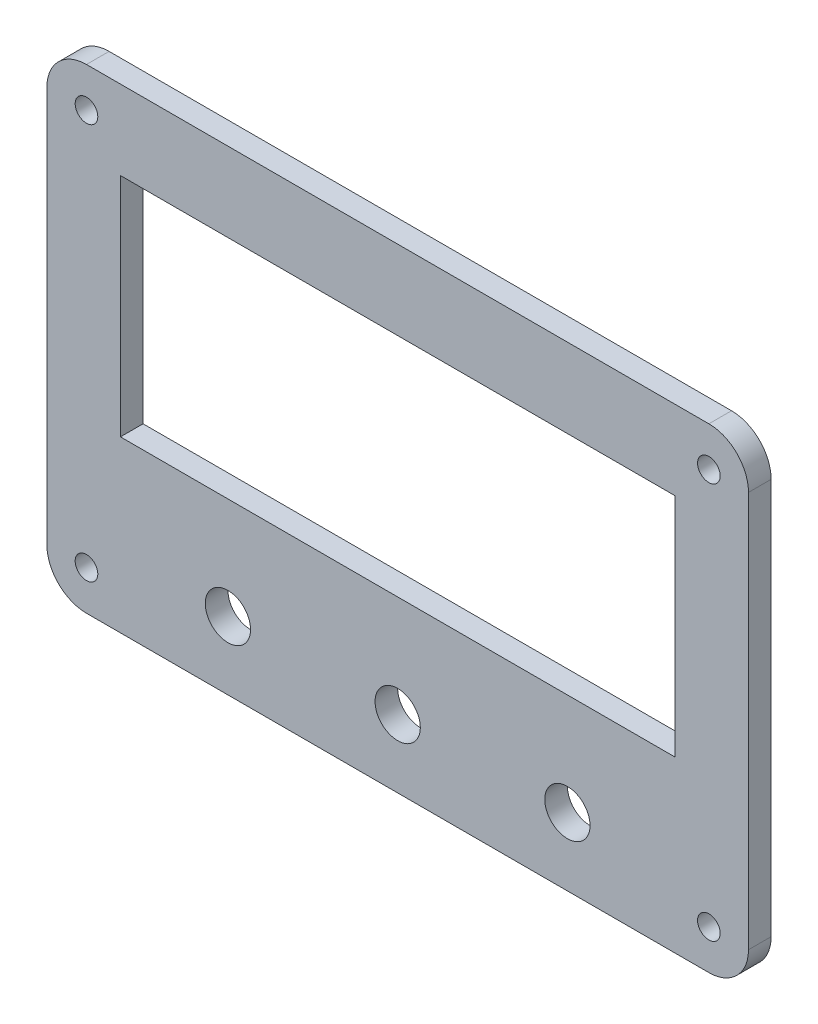
ISO-10303-21;
HEADER;
FILE_DESCRIPTION(('STEP AP214'),'2;1');
FILE_NAME('part.step','',(''),(''),'','','');
FILE_SCHEMA(('AUTOMOTIVE_DESIGN { 1 0 10303 214 1 1 1 1 }'));
ENDSEC;
DATA;
#1=APPLICATION_CONTEXT('core data for automotive mechanical design processes');
#2=APPLICATION_PROTOCOL_DEFINITION('international standard','automotive_design',2000,#1);
#3=PRODUCT_CONTEXT('',#1,'mechanical');
#4=PRODUCT('Part','Part','',(#3));
#5=PRODUCT_RELATED_PRODUCT_CATEGORY('part','',(#4));
#6=PRODUCT_DEFINITION_FORMATION('','',#4);
#7=PRODUCT_DEFINITION_CONTEXT('part definition',#1,'design');
#8=PRODUCT_DEFINITION('design','',#6,#7);
#9=PRODUCT_DEFINITION_SHAPE('','',#8);
#10=(LENGTH_UNIT() NAMED_UNIT(*) SI_UNIT(.MILLI.,.METRE.));
#11=(NAMED_UNIT(*) PLANE_ANGLE_UNIT() SI_UNIT($,.RADIAN.));
#12=(NAMED_UNIT(*) SI_UNIT($,.STERADIAN.) SOLID_ANGLE_UNIT());
#13=UNCERTAINTY_MEASURE_WITH_UNIT(LENGTH_MEASURE(1.E-05),#10,'distance_accuracy_value','');
#14=(GEOMETRIC_REPRESENTATION_CONTEXT(3) GLOBAL_UNCERTAINTY_ASSIGNED_CONTEXT((#13)) GLOBAL_UNIT_ASSIGNED_CONTEXT((#10,
#11,#12)) REPRESENTATION_CONTEXT('',''));
#15=CARTESIAN_POINT('',(0.,0.,0.));
#16=DIRECTION('',(0.,0.,1.));
#17=DIRECTION('',(1.,0.,0.));
#18=AXIS2_PLACEMENT_3D('',#15,#16,#17);
#19=CARTESIAN_POINT('',(0.,0.,4.));
#20=DIRECTION('',(0.,0.,1.));
#21=DIRECTION('',(1.,0.,0.));
#22=AXIS2_PLACEMENT_3D('',#19,#20,#21);
#23=PLANE('',#22);
#24=CARTESIAN_POINT('',(62.,12.,4.));
#25=DIRECTION('',(0.,0.,1.));
#26=DIRECTION('',(1.,0.,0.));
#27=AXIS2_PLACEMENT_3D('',#24,#25,#26);
#28=CIRCLE('',#27,4.00000000000001);
#29=CARTESIAN_POINT('',(66.,12.,4.));
#30=VERTEX_POINT('',#29);
#31=EDGE_CURVE('E475',#30,#30,#28,.T.);
#32=ORIENTED_EDGE('',*,*,#31,.F.);
#33=EDGE_LOOP('',(#32));
#34=FACE_BOUND('',#33,.T.);
#35=DIRECTION('',(1.,0.,0.));
#36=VECTOR('',#35,1.);
#37=CARTESIAN_POINT('',(111.,30.,4.));
#38=LINE('',#37,#36);
#39=CARTESIAN_POINT('',(13.,30.,4.));
#40=VERTEX_POINT('',#39);
#41=CARTESIAN_POINT('',(111.,30.,4.));
#42=VERTEX_POINT('',#41);
#43=EDGE_CURVE('E134',#40,#42,#38,.T.);
#44=ORIENTED_EDGE('',*,*,#43,.F.);
#45=DIRECTION('',(0.,-1.,0.));
#46=VECTOR('',#45,1.);
#47=CARTESIAN_POINT('',(13.,30.,4.));
#48=LINE('',#47,#46);
#49=CARTESIAN_POINT('',(13.,70.,4.));
#50=VERTEX_POINT('',#49);
#51=EDGE_CURVE('E124',#50,#40,#48,.T.);
#52=ORIENTED_EDGE('',*,*,#51,.F.);
#53=DIRECTION('',(-1.,0.,0.));
#54=VECTOR('',#53,1.);
#55=CARTESIAN_POINT('',(13.,70.,4.));
#56=LINE('',#55,#54);
#57=CARTESIAN_POINT('',(111.,70.,4.));
#58=VERTEX_POINT('',#57);
#59=EDGE_CURVE('E150',#58,#50,#56,.T.);
#60=ORIENTED_EDGE('',*,*,#59,.F.);
#61=DIRECTION('',(0.,1.,0.));
#62=VECTOR('',#61,1.);
#63=CARTESIAN_POINT('',(111.,70.,4.));
#64=LINE('',#63,#62);
#65=EDGE_CURVE('E148',#42,#58,#64,.T.);
#66=ORIENTED_EDGE('',*,*,#65,.F.);
#67=EDGE_LOOP('',(#44,#52,#60,#66));
#68=FACE_BOUND('',#67,.T.);
#69=CARTESIAN_POINT('',(7.00000000000001,7.00000000000001,4.));
#70=DIRECTION('',(0.,0.,1.));
#71=DIRECTION('',(1.,0.,0.));
#72=AXIS2_PLACEMENT_3D('',#69,#70,#71);
#73=CIRCLE('',#72,2.);
#74=CARTESIAN_POINT('',(9.00000000000001,7.00000000000001,4.));
#75=VERTEX_POINT('',#74);
#76=EDGE_CURVE('E168',#75,#75,#73,.T.);
#77=ORIENTED_EDGE('',*,*,#76,.F.);
#78=EDGE_LOOP('',(#77));
#79=FACE_BOUND('',#78,.T.);
#80=CARTESIAN_POINT('',(117.,77.,4.));
#81=DIRECTION('',(0.,0.,1.));
#82=DIRECTION('',(1.,0.,0.));
#83=AXIS2_PLACEMENT_3D('',#80,#81,#82);
#84=CIRCLE('',#83,2.);
#85=CARTESIAN_POINT('',(119.,77.,4.));
#86=VERTEX_POINT('',#85);
#87=EDGE_CURVE('E180',#86,#86,#84,.T.);
#88=ORIENTED_EDGE('',*,*,#87,.F.);
#89=EDGE_LOOP('',(#88));
#90=FACE_BOUND('',#89,.T.);
#91=DIRECTION('',(0.,-1.,0.));
#92=VECTOR('',#91,1.);
#93=CARTESIAN_POINT('',(0.,84.,4.));
#94=LINE('',#93,#92);
#95=CARTESIAN_POINT('',(0.,77.,4.));
#96=VERTEX_POINT('',#95);
#97=CARTESIAN_POINT('',(0.,7.00000000000003,4.));
#98=VERTEX_POINT('',#97);
#99=EDGE_CURVE('E192',#96,#98,#94,.T.);
#100=ORIENTED_EDGE('',*,*,#99,.T.);
#101=CARTESIAN_POINT('',(7.,7.,4.));
#102=DIRECTION('',(0.,0.,1.));
#103=DIRECTION('',(1.,0.,0.));
#104=AXIS2_PLACEMENT_3D('',#101,#102,#103);
#105=CIRCLE('',#104,7.);
#106=CARTESIAN_POINT('',(7.,0.,4.));
#107=VERTEX_POINT('',#106);
#108=EDGE_CURVE('E235',#98,#107,#105,.T.);
#109=ORIENTED_EDGE('',*,*,#108,.T.);
#110=DIRECTION('',(1.,0.,0.));
#111=VECTOR('',#110,1.);
#112=CARTESIAN_POINT('',(0.,0.,4.));
#113=LINE('',#112,#111);
#114=CARTESIAN_POINT('',(117.,0.,4.));
#115=VERTEX_POINT('',#114);
#116=EDGE_CURVE('E195',#107,#115,#113,.T.);
#117=ORIENTED_EDGE('',*,*,#116,.T.);
#118=CARTESIAN_POINT('',(117.,7.,4.));
#119=DIRECTION('',(0.,0.,1.));
#120=DIRECTION('',(1.,0.,0.));
#121=AXIS2_PLACEMENT_3D('',#118,#119,#120);
#122=CIRCLE('',#121,7.);
#123=CARTESIAN_POINT('',(124.,7.,4.));
#124=VERTEX_POINT('',#123);
#125=EDGE_CURVE('E233',#115,#124,#122,.T.);
#126=ORIENTED_EDGE('',*,*,#125,.T.);
#127=DIRECTION('',(0.,1.,0.));
#128=VECTOR('',#127,1.);
#129=CARTESIAN_POINT('',(124.,0.,4.));
#130=LINE('',#129,#128);
#131=CARTESIAN_POINT('',(124.,77.,4.));
#132=VERTEX_POINT('',#131);
#133=EDGE_CURVE('E199',#124,#132,#130,.T.);
#134=ORIENTED_EDGE('',*,*,#133,.T.);
#135=CARTESIAN_POINT('',(117.,77.,4.));
#136=DIRECTION('',(0.,0.,1.));
#137=DIRECTION('',(1.,0.,0.));
#138=AXIS2_PLACEMENT_3D('',#135,#136,#137);
#139=CIRCLE('',#138,7.);
#140=CARTESIAN_POINT('',(117.,84.,4.));
#141=VERTEX_POINT('',#140);
#142=EDGE_CURVE('E54',#132,#141,#139,.T.);
#143=ORIENTED_EDGE('',*,*,#142,.T.);
#144=DIRECTION('',(-1.,0.,0.));
#145=VECTOR('',#144,1.);
#146=CARTESIAN_POINT('',(0.,84.,4.));
#147=LINE('',#146,#145);
#148=CARTESIAN_POINT('',(7.,84.,4.));
#149=VERTEX_POINT('',#148);
#150=EDGE_CURVE('E201',#141,#149,#147,.T.);
#151=ORIENTED_EDGE('',*,*,#150,.T.);
#152=CARTESIAN_POINT('',(7.,77.,4.));
#153=DIRECTION('',(0.,0.,1.));
#154=DIRECTION('',(1.,0.,0.));
#155=AXIS2_PLACEMENT_3D('',#152,#153,#154);
#156=CIRCLE('',#155,7.);
#157=EDGE_CURVE('E230',#149,#96,#156,.T.);
#158=ORIENTED_EDGE('',*,*,#157,.T.);
#159=EDGE_LOOP('',(#100,#109,#117,#126,#134,#143,#151,#158));
#160=FACE_BOUND('',#159,.T.);
#161=CARTESIAN_POINT('',(7.00000000000001,77.,4.));
#162=DIRECTION('',(0.,0.,1.));
#163=DIRECTION('',(1.,0.,0.));
#164=AXIS2_PLACEMENT_3D('',#161,#162,#163);
#165=CIRCLE('',#164,2.);
#166=CARTESIAN_POINT('',(9.00000000000001,77.,4.));
#167=VERTEX_POINT('',#166);
#168=EDGE_CURVE('E186',#167,#167,#165,.T.);
#169=ORIENTED_EDGE('',*,*,#168,.F.);
#170=EDGE_LOOP('',(#169));
#171=FACE_BOUND('',#170,.T.);
#172=CARTESIAN_POINT('',(117.,7.00000000000001,4.));
#173=DIRECTION('',(0.,0.,1.));
#174=DIRECTION('',(1.,0.,0.));
#175=AXIS2_PLACEMENT_3D('',#172,#173,#174);
#176=CIRCLE('',#175,2.);
#177=CARTESIAN_POINT('',(119.,7.00000000000001,4.));
#178=VERTEX_POINT('',#177);
#179=EDGE_CURVE('E174',#178,#178,#176,.T.);
#180=ORIENTED_EDGE('',*,*,#179,.F.);
#181=EDGE_LOOP('',(#180));
#182=FACE_BOUND('',#181,.T.);
#183=CARTESIAN_POINT('',(32.,12.,4.));
#184=DIRECTION('',(0.,0.,1.));
#185=DIRECTION('',(1.,0.,0.));
#186=AXIS2_PLACEMENT_3D('',#183,#184,#185);
#187=CIRCLE('',#186,4.00000000000001);
#188=CARTESIAN_POINT('',(36.,12.,4.));
#189=VERTEX_POINT('',#188);
#190=EDGE_CURVE('E157',#189,#189,#187,.T.);
#191=ORIENTED_EDGE('',*,*,#190,.F.);
#192=EDGE_LOOP('',(#191));
#193=FACE_BOUND('',#192,.T.);
#194=CARTESIAN_POINT('',(92.,12.,4.));
#195=DIRECTION('',(0.,0.,1.));
#196=DIRECTION('',(1.,0.,0.));
#197=AXIS2_PLACEMENT_3D('',#194,#195,#196);
#198=CIRCLE('',#197,4.00000000000001);
#199=CARTESIAN_POINT('',(96.,12.,4.));
#200=VERTEX_POINT('',#199);
#201=EDGE_CURVE('E466',#200,#200,#198,.T.);
#202=ORIENTED_EDGE('',*,*,#201,.F.);
#203=EDGE_LOOP('',(#202));
#204=FACE_BOUND('',#203,.T.);
#205=ADVANCED_FACE('F33',(#34,#68,#79,#90,#160,#171,#182,#193,#204),#23,.T.);
#206=CARTESIAN_POINT('',(0.,0.,0.));
#207=DIRECTION('',(0.,0.,1.));
#208=DIRECTION('',(1.,0.,0.));
#209=AXIS2_PLACEMENT_3D('',#206,#207,#208);
#210=PLANE('',#209);
#211=CARTESIAN_POINT('',(7.00000000000001,7.00000000000001,0.));
#212=DIRECTION('',(0.,0.,1.));
#213=DIRECTION('',(1.,0.,0.));
#214=AXIS2_PLACEMENT_3D('',#211,#212,#213);
#215=CIRCLE('',#214,2.);
#216=CARTESIAN_POINT('',(9.00000000000001,7.00000000000001,0.));
#217=VERTEX_POINT('',#216);
#218=EDGE_CURVE('E142',#217,#217,#215,.T.);
#219=ORIENTED_EDGE('',*,*,#218,.T.);
#220=EDGE_LOOP('',(#219));
#221=FACE_BOUND('',#220,.T.);
#222=CARTESIAN_POINT('',(117.,7.00000000000001,0.));
#223=DIRECTION('',(0.,0.,1.));
#224=DIRECTION('',(1.,0.,0.));
#225=AXIS2_PLACEMENT_3D('',#222,#223,#224);
#226=CIRCLE('',#225,2.);
#227=CARTESIAN_POINT('',(119.,7.00000000000001,0.));
#228=VERTEX_POINT('',#227);
#229=EDGE_CURVE('E171',#228,#228,#226,.T.);
#230=ORIENTED_EDGE('',*,*,#229,.T.);
#231=EDGE_LOOP('',(#230));
#232=FACE_BOUND('',#231,.T.);
#233=CARTESIAN_POINT('',(117.,77.,0.));
#234=DIRECTION('',(0.,0.,1.));
#235=DIRECTION('',(1.,0.,0.));
#236=AXIS2_PLACEMENT_3D('',#233,#234,#235);
#237=CIRCLE('',#236,2.);
#238=CARTESIAN_POINT('',(119.,77.,0.));
#239=VERTEX_POINT('',#238);
#240=EDGE_CURVE('E177',#239,#239,#237,.T.);
#241=ORIENTED_EDGE('',*,*,#240,.T.);
#242=EDGE_LOOP('',(#241));
#243=FACE_BOUND('',#242,.T.);
#244=CARTESIAN_POINT('',(7.00000000000001,77.,0.));
#245=DIRECTION('',(0.,0.,1.));
#246=DIRECTION('',(1.,0.,0.));
#247=AXIS2_PLACEMENT_3D('',#244,#245,#246);
#248=CIRCLE('',#247,2.);
#249=CARTESIAN_POINT('',(9.00000000000001,77.,0.));
#250=VERTEX_POINT('',#249);
#251=EDGE_CURVE('E183',#250,#250,#248,.T.);
#252=ORIENTED_EDGE('',*,*,#251,.T.);
#253=EDGE_LOOP('',(#252));
#254=FACE_BOUND('',#253,.T.);
#255=DIRECTION('',(1.,0.,0.));
#256=VECTOR('',#255,1.);
#257=CARTESIAN_POINT('',(0.,0.,0.));
#258=LINE('',#257,#256);
#259=CARTESIAN_POINT('',(7.,0.,0.));
#260=VERTEX_POINT('',#259);
#261=CARTESIAN_POINT('',(117.,0.,0.));
#262=VERTEX_POINT('',#261);
#263=EDGE_CURVE('E206',#260,#262,#258,.T.);
#264=ORIENTED_EDGE('',*,*,#263,.F.);
#265=CARTESIAN_POINT('',(7.,7.,0.));
#266=DIRECTION('',(0.,0.,1.));
#267=DIRECTION('',(1.,0.,0.));
#268=AXIS2_PLACEMENT_3D('',#265,#266,#267);
#269=CIRCLE('',#268,7.);
#270=CARTESIAN_POINT('',(0.,7.00000000000003,0.));
#271=VERTEX_POINT('',#270);
#272=EDGE_CURVE('E223',#260,#271,#269,.F.);
#273=ORIENTED_EDGE('',*,*,#272,.T.);
#274=DIRECTION('',(0.,-1.,0.));
#275=VECTOR('',#274,1.);
#276=CARTESIAN_POINT('',(0.,84.,0.));
#277=LINE('',#276,#275);
#278=CARTESIAN_POINT('',(0.,77.,0.));
#279=VERTEX_POINT('',#278);
#280=EDGE_CURVE('E189',#279,#271,#277,.T.);
#281=ORIENTED_EDGE('',*,*,#280,.F.);
#282=CARTESIAN_POINT('',(7.,77.,0.));
#283=DIRECTION('',(0.,0.,1.));
#284=DIRECTION('',(1.,0.,0.));
#285=AXIS2_PLACEMENT_3D('',#282,#283,#284);
#286=CIRCLE('',#285,7.);
#287=CARTESIAN_POINT('',(7.,84.,0.));
#288=VERTEX_POINT('',#287);
#289=EDGE_CURVE('E217',#279,#288,#286,.F.);
#290=ORIENTED_EDGE('',*,*,#289,.T.);
#291=DIRECTION('',(-1.,0.,0.));
#292=VECTOR('',#291,1.);
#293=CARTESIAN_POINT('',(0.,84.,0.));
#294=LINE('',#293,#292);
#295=CARTESIAN_POINT('',(117.,84.,0.));
#296=VERTEX_POINT('',#295);
#297=EDGE_CURVE('E196',#296,#288,#294,.T.);
#298=ORIENTED_EDGE('',*,*,#297,.F.);
#299=CARTESIAN_POINT('',(117.,77.,0.));
#300=DIRECTION('',(0.,0.,1.));
#301=DIRECTION('',(1.,0.,0.));
#302=AXIS2_PLACEMENT_3D('',#299,#300,#301);
#303=CIRCLE('',#302,7.);
#304=CARTESIAN_POINT('',(124.,77.,0.));
#305=VERTEX_POINT('',#304);
#306=EDGE_CURVE('E219',#296,#305,#303,.F.);
#307=ORIENTED_EDGE('',*,*,#306,.T.);
#308=DIRECTION('',(0.,1.,0.));
#309=VECTOR('',#308,1.);
#310=CARTESIAN_POINT('',(124.,0.,0.));
#311=LINE('',#310,#309);
#312=CARTESIAN_POINT('',(124.,7.,0.));
#313=VERTEX_POINT('',#312);
#314=EDGE_CURVE('E209',#313,#305,#311,.T.);
#315=ORIENTED_EDGE('',*,*,#314,.F.);
#316=CARTESIAN_POINT('',(117.,7.,0.));
#317=DIRECTION('',(0.,0.,1.));
#318=DIRECTION('',(1.,0.,0.));
#319=AXIS2_PLACEMENT_3D('',#316,#317,#318);
#320=CIRCLE('',#319,7.);
#321=EDGE_CURVE('E221',#313,#262,#320,.F.);
#322=ORIENTED_EDGE('',*,*,#321,.T.);
#323=EDGE_LOOP('',(#264,#273,#281,#290,#298,#307,#315,#322));
#324=FACE_BOUND('',#323,.T.);
#325=DIRECTION('',(0.,-1.,0.));
#326=VECTOR('',#325,1.);
#327=CARTESIAN_POINT('',(13.,30.,0.));
#328=LINE('',#327,#326);
#329=CARTESIAN_POINT('',(13.,70.,0.));
#330=VERTEX_POINT('',#329);
#331=CARTESIAN_POINT('',(13.,30.,0.));
#332=VERTEX_POINT('',#331);
#333=EDGE_CURVE('E155',#330,#332,#328,.T.);
#334=ORIENTED_EDGE('',*,*,#333,.T.);
#335=DIRECTION('',(1.,0.,0.));
#336=VECTOR('',#335,1.);
#337=CARTESIAN_POINT('',(111.,30.,0.));
#338=LINE('',#337,#336);
#339=CARTESIAN_POINT('',(111.,30.,0.));
#340=VERTEX_POINT('',#339);
#341=EDGE_CURVE('E141',#332,#340,#338,.T.);
#342=ORIENTED_EDGE('',*,*,#341,.T.);
#343=DIRECTION('',(0.,1.,0.));
#344=VECTOR('',#343,1.);
#345=CARTESIAN_POINT('',(111.,70.,0.));
#346=LINE('',#345,#344);
#347=CARTESIAN_POINT('',(111.,70.,0.));
#348=VERTEX_POINT('',#347);
#349=EDGE_CURVE('E159',#340,#348,#346,.T.);
#350=ORIENTED_EDGE('',*,*,#349,.T.);
#351=DIRECTION('',(-1.,0.,0.));
#352=VECTOR('',#351,1.);
#353=CARTESIAN_POINT('',(13.,70.,0.));
#354=LINE('',#353,#352);
#355=EDGE_CURVE('E135',#348,#330,#354,.T.);
#356=ORIENTED_EDGE('',*,*,#355,.T.);
#357=EDGE_LOOP('',(#334,#342,#350,#356));
#358=FACE_BOUND('',#357,.T.);
#359=CARTESIAN_POINT('',(32.,12.,0.));
#360=DIRECTION('',(0.,0.,1.));
#361=DIRECTION('',(1.,0.,0.));
#362=AXIS2_PLACEMENT_3D('',#359,#360,#361);
#363=CIRCLE('',#362,4.00000000000001);
#364=CARTESIAN_POINT('',(36.,12.,0.));
#365=VERTEX_POINT('',#364);
#366=EDGE_CURVE('E478',#365,#365,#363,.T.);
#367=ORIENTED_EDGE('',*,*,#366,.T.);
#368=EDGE_LOOP('',(#367));
#369=FACE_BOUND('',#368,.T.);
#370=CARTESIAN_POINT('',(62.,12.,0.));
#371=DIRECTION('',(0.,0.,1.));
#372=DIRECTION('',(1.,0.,0.));
#373=AXIS2_PLACEMENT_3D('',#370,#371,#372);
#374=CIRCLE('',#373,4.00000000000001);
#375=CARTESIAN_POINT('',(66.,12.,0.));
#376=VERTEX_POINT('',#375);
#377=EDGE_CURVE('E472',#376,#376,#374,.T.);
#378=ORIENTED_EDGE('',*,*,#377,.T.);
#379=EDGE_LOOP('',(#378));
#380=FACE_BOUND('',#379,.T.);
#381=CARTESIAN_POINT('',(92.,12.,0.));
#382=DIRECTION('',(0.,0.,1.));
#383=DIRECTION('',(1.,0.,0.));
#384=AXIS2_PLACEMENT_3D('',#381,#382,#383);
#385=CIRCLE('',#384,4.00000000000001);
#386=CARTESIAN_POINT('',(96.,12.,0.));
#387=VERTEX_POINT('',#386);
#388=EDGE_CURVE('E469',#387,#387,#385,.T.);
#389=ORIENTED_EDGE('',*,*,#388,.T.);
#390=EDGE_LOOP('',(#389));
#391=FACE_BOUND('',#390,.T.);
#392=ADVANCED_FACE('F251',(#221,#232,#243,#254,#324,#358,#369,#380,#391),#210,.F.);
#393=CARTESIAN_POINT('',(0.,84.,4.));
#394=DIRECTION('',(1.,0.,0.));
#395=DIRECTION('',(0.,0.,-1.));
#396=AXIS2_PLACEMENT_3D('',#393,#394,#395);
#397=PLANE('',#396);
#398=ORIENTED_EDGE('',*,*,#280,.T.);
#399=DIRECTION('',(0.,0.,-1.));
#400=VECTOR('',#399,1.);
#401=CARTESIAN_POINT('',(0.,7.00000000000001,4.));
#402=LINE('',#401,#400);
#403=EDGE_CURVE('E228',#271,#98,#402,.F.);
#404=ORIENTED_EDGE('',*,*,#403,.T.);
#405=ORIENTED_EDGE('',*,*,#99,.F.);
#406=DIRECTION('',(0.,0.,-1.));
#407=VECTOR('',#406,1.);
#408=CARTESIAN_POINT('',(0.,77.,4.));
#409=LINE('',#408,#407);
#410=EDGE_CURVE('E225',#96,#279,#409,.T.);
#411=ORIENTED_EDGE('',*,*,#410,.T.);
#412=EDGE_LOOP('',(#398,#404,#405,#411));
#413=FACE_BOUND('',#412,.T.);
#414=ADVANCED_FACE('F265',(#413),#397,.F.);
#415=CARTESIAN_POINT('',(0.,0.,4.));
#416=DIRECTION('',(0.,1.,0.));
#417=DIRECTION('',(0.,0.,1.));
#418=AXIS2_PLACEMENT_3D('',#415,#416,#417);
#419=PLANE('',#418);
#420=ORIENTED_EDGE('',*,*,#116,.F.);
#421=DIRECTION('',(0.,0.,-1.));
#422=VECTOR('',#421,1.);
#423=CARTESIAN_POINT('',(7.,0.,4.));
#424=LINE('',#423,#422);
#425=EDGE_CURVE('E214',#107,#260,#424,.T.);
#426=ORIENTED_EDGE('',*,*,#425,.T.);
#427=ORIENTED_EDGE('',*,*,#263,.T.);
#428=DIRECTION('',(0.,0.,-1.));
#429=VECTOR('',#428,1.);
#430=CARTESIAN_POINT('',(117.,0.,4.));
#431=LINE('',#430,#429);
#432=EDGE_CURVE('E203',#262,#115,#431,.F.);
#433=ORIENTED_EDGE('',*,*,#432,.T.);
#434=EDGE_LOOP('',(#420,#426,#427,#433));
#435=FACE_BOUND('',#434,.T.);
#436=ADVANCED_FACE('F273',(#435),#419,.F.);
#437=CARTESIAN_POINT('',(124.,0.,4.));
#438=DIRECTION('',(-1.,0.,0.));
#439=DIRECTION('',(0.,0.,1.));
#440=AXIS2_PLACEMENT_3D('',#437,#438,#439);
#441=PLANE('',#440);
#442=ORIENTED_EDGE('',*,*,#133,.F.);
#443=DIRECTION('',(0.,0.,-1.));
#444=VECTOR('',#443,1.);
#445=CARTESIAN_POINT('',(124.,7.,4.));
#446=LINE('',#445,#444);
#447=EDGE_CURVE('E239',#124,#313,#446,.T.);
#448=ORIENTED_EDGE('',*,*,#447,.T.);
#449=ORIENTED_EDGE('',*,*,#314,.T.);
#450=DIRECTION('',(0.,0.,-1.));
#451=VECTOR('',#450,1.);
#452=CARTESIAN_POINT('',(124.,77.,4.));
#453=LINE('',#452,#451);
#454=EDGE_CURVE('E237',#305,#132,#453,.F.);
#455=ORIENTED_EDGE('',*,*,#454,.T.);
#456=EDGE_LOOP('',(#442,#448,#449,#455));
#457=FACE_BOUND('',#456,.T.);
#458=ADVANCED_FACE('F245',(#457),#441,.F.);
#459=CARTESIAN_POINT('',(0.,84.,4.));
#460=DIRECTION('',(0.,-1.,0.));
#461=DIRECTION('',(0.,0.,-1.));
#462=AXIS2_PLACEMENT_3D('',#459,#460,#461);
#463=PLANE('',#462);
#464=ORIENTED_EDGE('',*,*,#150,.F.);
#465=DIRECTION('',(0.,0.,-1.));
#466=VECTOR('',#465,1.);
#467=CARTESIAN_POINT('',(117.,84.,4.));
#468=LINE('',#467,#466);
#469=EDGE_CURVE('E11',#141,#296,#468,.T.);
#470=ORIENTED_EDGE('',*,*,#469,.T.);
#471=ORIENTED_EDGE('',*,*,#297,.T.);
#472=DIRECTION('',(0.,0.,-1.));
#473=VECTOR('',#472,1.);
#474=CARTESIAN_POINT('',(7.,84.,4.));
#475=LINE('',#474,#473);
#476=EDGE_CURVE('E41',#288,#149,#475,.F.);
#477=ORIENTED_EDGE('',*,*,#476,.T.);
#478=EDGE_LOOP('',(#464,#470,#471,#477));
#479=FACE_BOUND('',#478,.T.);
#480=ADVANCED_FACE('F257',(#479),#463,.F.);
#481=CARTESIAN_POINT('',(7.00000000000001,77.,4.));
#482=DIRECTION('',(0.,0.,-1.));
#483=DIRECTION('',(-1.,0.,0.));
#484=AXIS2_PLACEMENT_3D('',#481,#482,#483);
#485=CYLINDRICAL_SURFACE('',#484,2.);
#486=ORIENTED_EDGE('',*,*,#168,.T.);
#487=EDGE_LOOP('',(#486));
#488=FACE_BOUND('',#487,.T.);
#489=ORIENTED_EDGE('',*,*,#251,.F.);
#490=EDGE_LOOP('',(#489));
#491=FACE_BOUND('',#490,.T.);
#492=ADVANCED_FACE('F294',(#488,#491),#485,.F.);
#493=CARTESIAN_POINT('',(117.,77.,4.));
#494=DIRECTION('',(0.,0.,-1.));
#495=DIRECTION('',(-1.,0.,0.));
#496=AXIS2_PLACEMENT_3D('',#493,#494,#495);
#497=CYLINDRICAL_SURFACE('',#496,2.);
#498=ORIENTED_EDGE('',*,*,#87,.T.);
#499=EDGE_LOOP('',(#498));
#500=FACE_BOUND('',#499,.T.);
#501=ORIENTED_EDGE('',*,*,#240,.F.);
#502=EDGE_LOOP('',(#501));
#503=FACE_BOUND('',#502,.T.);
#504=ADVANCED_FACE('F327',(#500,#503),#497,.F.);
#505=CARTESIAN_POINT('',(117.,7.00000000000001,4.));
#506=DIRECTION('',(0.,0.,-1.));
#507=DIRECTION('',(-1.,0.,0.));
#508=AXIS2_PLACEMENT_3D('',#505,#506,#507);
#509=CYLINDRICAL_SURFACE('',#508,2.);
#510=ORIENTED_EDGE('',*,*,#179,.T.);
#511=EDGE_LOOP('',(#510));
#512=FACE_BOUND('',#511,.T.);
#513=ORIENTED_EDGE('',*,*,#229,.F.);
#514=EDGE_LOOP('',(#513));
#515=FACE_BOUND('',#514,.T.);
#516=ADVANCED_FACE('F334',(#512,#515),#509,.F.);
#517=CARTESIAN_POINT('',(7.00000000000001,7.00000000000001,4.));
#518=DIRECTION('',(0.,0.,-1.));
#519=DIRECTION('',(-1.,0.,0.));
#520=AXIS2_PLACEMENT_3D('',#517,#518,#519);
#521=CYLINDRICAL_SURFACE('',#520,2.);
#522=ORIENTED_EDGE('',*,*,#76,.T.);
#523=EDGE_LOOP('',(#522));
#524=FACE_BOUND('',#523,.T.);
#525=ORIENTED_EDGE('',*,*,#218,.F.);
#526=EDGE_LOOP('',(#525));
#527=FACE_BOUND('',#526,.T.);
#528=ADVANCED_FACE('F341',(#524,#527),#521,.F.);
#529=CARTESIAN_POINT('',(13.,30.,4.));
#530=DIRECTION('',(1.,0.,0.));
#531=DIRECTION('',(0.,0.,-1.));
#532=AXIS2_PLACEMENT_3D('',#529,#530,#531);
#533=PLANE('',#532);
#534=ORIENTED_EDGE('',*,*,#333,.F.);
#535=DIRECTION('',(0.,0.,-1.));
#536=VECTOR('',#535,1.);
#537=CARTESIAN_POINT('',(13.,70.,4.));
#538=LINE('',#537,#536);
#539=EDGE_CURVE('E130',#50,#330,#538,.T.);
#540=ORIENTED_EDGE('',*,*,#539,.F.);
#541=ORIENTED_EDGE('',*,*,#51,.T.);
#542=DIRECTION('',(0.,0.,-1.));
#543=VECTOR('',#542,1.);
#544=CARTESIAN_POINT('',(13.,30.,4.));
#545=LINE('',#544,#543);
#546=EDGE_CURVE('E127',#40,#332,#545,.T.);
#547=ORIENTED_EDGE('',*,*,#546,.T.);
#548=EDGE_LOOP('',(#534,#540,#541,#547));
#549=FACE_BOUND('',#548,.T.);
#550=ADVANCED_FACE('F126',(#549),#533,.T.);
#551=CARTESIAN_POINT('',(111.,30.,4.));
#552=DIRECTION('',(0.,1.,0.));
#553=DIRECTION('',(0.,0.,1.));
#554=AXIS2_PLACEMENT_3D('',#551,#552,#553);
#555=PLANE('',#554);
#556=ORIENTED_EDGE('',*,*,#341,.F.);
#557=ORIENTED_EDGE('',*,*,#546,.F.);
#558=ORIENTED_EDGE('',*,*,#43,.T.);
#559=DIRECTION('',(0.,0.,-1.));
#560=VECTOR('',#559,1.);
#561=CARTESIAN_POINT('',(111.,30.,4.));
#562=LINE('',#561,#560);
#563=EDGE_CURVE('E143',#42,#340,#562,.T.);
#564=ORIENTED_EDGE('',*,*,#563,.T.);
#565=EDGE_LOOP('',(#556,#557,#558,#564));
#566=FACE_BOUND('',#565,.T.);
#567=ADVANCED_FACE('F138',(#566),#555,.T.);
#568=CARTESIAN_POINT('',(111.,70.,4.));
#569=DIRECTION('',(-1.,0.,0.));
#570=DIRECTION('',(0.,0.,1.));
#571=AXIS2_PLACEMENT_3D('',#568,#569,#570);
#572=PLANE('',#571);
#573=ORIENTED_EDGE('',*,*,#349,.F.);
#574=ORIENTED_EDGE('',*,*,#563,.F.);
#575=ORIENTED_EDGE('',*,*,#65,.T.);
#576=DIRECTION('',(0.,0.,-1.));
#577=VECTOR('',#576,1.);
#578=CARTESIAN_POINT('',(111.,70.,4.));
#579=LINE('',#578,#577);
#580=EDGE_CURVE('E165',#58,#348,#579,.T.);
#581=ORIENTED_EDGE('',*,*,#580,.T.);
#582=EDGE_LOOP('',(#573,#574,#575,#581));
#583=FACE_BOUND('',#582,.T.);
#584=ADVANCED_FACE('F362',(#583),#572,.T.);
#585=CARTESIAN_POINT('',(13.,70.,4.));
#586=DIRECTION('',(0.,-1.,0.));
#587=DIRECTION('',(0.,0.,-1.));
#588=AXIS2_PLACEMENT_3D('',#585,#586,#587);
#589=PLANE('',#588);
#590=ORIENTED_EDGE('',*,*,#355,.F.);
#591=ORIENTED_EDGE('',*,*,#580,.F.);
#592=ORIENTED_EDGE('',*,*,#59,.T.);
#593=ORIENTED_EDGE('',*,*,#539,.T.);
#594=EDGE_LOOP('',(#590,#591,#592,#593));
#595=FACE_BOUND('',#594,.T.);
#596=ADVANCED_FACE('F369',(#595),#589,.T.);
#597=CARTESIAN_POINT('',(32.,12.,4.));
#598=DIRECTION('',(0.,0.,-1.));
#599=DIRECTION('',(-1.,0.,0.));
#600=AXIS2_PLACEMENT_3D('',#597,#598,#599);
#601=CYLINDRICAL_SURFACE('',#600,4.00000000000001);
#602=ORIENTED_EDGE('',*,*,#190,.T.);
#603=EDGE_LOOP('',(#602));
#604=FACE_BOUND('',#603,.T.);
#605=ORIENTED_EDGE('',*,*,#366,.F.);
#606=EDGE_LOOP('',(#605));
#607=FACE_BOUND('',#606,.T.);
#608=ADVANCED_FACE('F377',(#604,#607),#601,.F.);
#609=CARTESIAN_POINT('',(62.,12.,4.));
#610=DIRECTION('',(0.,0.,-1.));
#611=DIRECTION('',(-1.,0.,0.));
#612=AXIS2_PLACEMENT_3D('',#609,#610,#611);
#613=CYLINDRICAL_SURFACE('',#612,4.00000000000001);
#614=ORIENTED_EDGE('',*,*,#31,.T.);
#615=EDGE_LOOP('',(#614));
#616=FACE_BOUND('',#615,.T.);
#617=ORIENTED_EDGE('',*,*,#377,.F.);
#618=EDGE_LOOP('',(#617));
#619=FACE_BOUND('',#618,.T.);
#620=ADVANCED_FACE('F385',(#616,#619),#613,.F.);
#621=CARTESIAN_POINT('',(92.,12.,4.));
#622=DIRECTION('',(0.,0.,-1.));
#623=DIRECTION('',(-1.,0.,0.));
#624=AXIS2_PLACEMENT_3D('',#621,#622,#623);
#625=CYLINDRICAL_SURFACE('',#624,4.00000000000001);
#626=ORIENTED_EDGE('',*,*,#201,.T.);
#627=EDGE_LOOP('',(#626));
#628=FACE_BOUND('',#627,.T.);
#629=ORIENTED_EDGE('',*,*,#388,.F.);
#630=EDGE_LOOP('',(#629));
#631=FACE_BOUND('',#630,.T.);
#632=ADVANCED_FACE('F282',(#628,#631),#625,.F.);
#633=CARTESIAN_POINT('',(7.,7.,4.));
#634=DIRECTION('',(0.,0.,-1.));
#635=DIRECTION('',(-1.,0.,0.));
#636=AXIS2_PLACEMENT_3D('',#633,#634,#635);
#637=CYLINDRICAL_SURFACE('',#636,7.);
#638=ORIENTED_EDGE('',*,*,#108,.F.);
#639=ORIENTED_EDGE('',*,*,#403,.F.);
#640=ORIENTED_EDGE('',*,*,#272,.F.);
#641=ORIENTED_EDGE('',*,*,#425,.F.);
#642=EDGE_LOOP('',(#638,#639,#640,#641));
#643=FACE_BOUND('',#642,.T.);
#644=ADVANCED_FACE('F270',(#643),#637,.T.);
#645=CARTESIAN_POINT('',(117.,7.,4.));
#646=DIRECTION('',(0.,0.,-1.));
#647=DIRECTION('',(-1.,0.,0.));
#648=AXIS2_PLACEMENT_3D('',#645,#646,#647);
#649=CYLINDRICAL_SURFACE('',#648,7.);
#650=ORIENTED_EDGE('',*,*,#125,.F.);
#651=ORIENTED_EDGE('',*,*,#432,.F.);
#652=ORIENTED_EDGE('',*,*,#321,.F.);
#653=ORIENTED_EDGE('',*,*,#447,.F.);
#654=EDGE_LOOP('',(#650,#651,#652,#653));
#655=FACE_BOUND('',#654,.T.);
#656=ADVANCED_FACE('F275',(#655),#649,.T.);
#657=CARTESIAN_POINT('',(117.,77.,4.));
#658=DIRECTION('',(0.,0.,-1.));
#659=DIRECTION('',(-1.,0.,0.));
#660=AXIS2_PLACEMENT_3D('',#657,#658,#659);
#661=CYLINDRICAL_SURFACE('',#660,7.);
#662=ORIENTED_EDGE('',*,*,#142,.F.);
#663=ORIENTED_EDGE('',*,*,#454,.F.);
#664=ORIENTED_EDGE('',*,*,#306,.F.);
#665=ORIENTED_EDGE('',*,*,#469,.F.);
#666=EDGE_LOOP('',(#662,#663,#664,#665));
#667=FACE_BOUND('',#666,.T.);
#668=ADVANCED_FACE('F256',(#667),#661,.T.);
#669=CARTESIAN_POINT('',(7.,77.,4.));
#670=DIRECTION('',(0.,0.,-1.));
#671=DIRECTION('',(-1.,0.,0.));
#672=AXIS2_PLACEMENT_3D('',#669,#670,#671);
#673=CYLINDRICAL_SURFACE('',#672,7.);
#674=ORIENTED_EDGE('',*,*,#157,.F.);
#675=ORIENTED_EDGE('',*,*,#476,.F.);
#676=ORIENTED_EDGE('',*,*,#289,.F.);
#677=ORIENTED_EDGE('',*,*,#410,.F.);
#678=EDGE_LOOP('',(#674,#675,#676,#677));
#679=FACE_BOUND('',#678,.T.);
#680=ADVANCED_FACE('F35',(#679),#673,.T.);
#681=CLOSED_SHELL('',(#205,#392,#414,#436,#458,#480,#492,#504,#516,#528,#550,#567,#584,#596,
#608,#620,#632,#644,#656,#668,#680));
#682=MANIFOLD_SOLID_BREP('B2',#681);
#683=ADVANCED_BREP_SHAPE_REPRESENTATION('',(#18,#682),#14);
#684=SHAPE_DEFINITION_REPRESENTATION(#9,#683);
ENDSEC;
END-ISO-10303-21;
